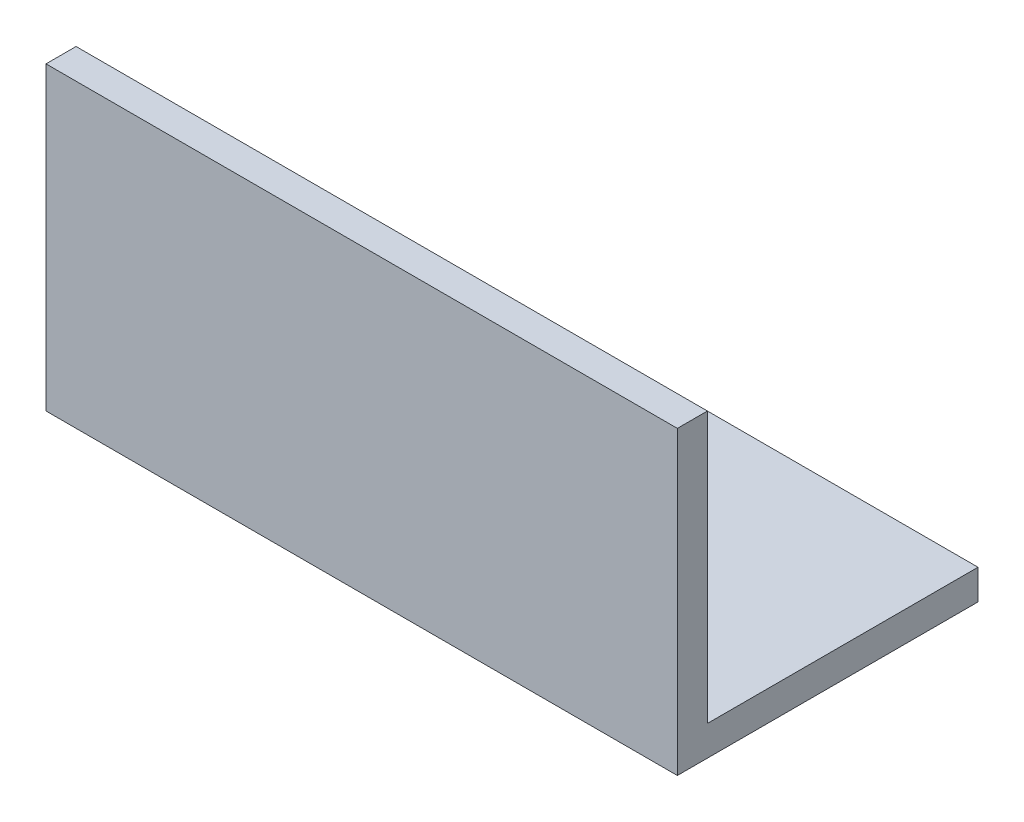
ISO-10303-21;
HEADER;
FILE_DESCRIPTION(('STEP AP214'),'2;1');
FILE_NAME('part.step','',(''),(''),'','','');
FILE_SCHEMA(('AUTOMOTIVE_DESIGN { 1 0 10303 214 1 1 1 1 }'));
ENDSEC;
DATA;
#1=APPLICATION_CONTEXT('core data for automotive mechanical design processes');
#2=APPLICATION_PROTOCOL_DEFINITION('international standard','automotive_design',2000,#1);
#3=PRODUCT_CONTEXT('',#1,'mechanical');
#4=PRODUCT('Part','Part','',(#3));
#5=PRODUCT_RELATED_PRODUCT_CATEGORY('part','',(#4));
#6=PRODUCT_DEFINITION_FORMATION('','',#4);
#7=PRODUCT_DEFINITION_CONTEXT('part definition',#1,'design');
#8=PRODUCT_DEFINITION('design','',#6,#7);
#9=PRODUCT_DEFINITION_SHAPE('','',#8);
#10=(LENGTH_UNIT() NAMED_UNIT(*) SI_UNIT(.MILLI.,.METRE.));
#11=(NAMED_UNIT(*) PLANE_ANGLE_UNIT() SI_UNIT($,.RADIAN.));
#12=(NAMED_UNIT(*) SI_UNIT($,.STERADIAN.) SOLID_ANGLE_UNIT());
#13=UNCERTAINTY_MEASURE_WITH_UNIT(LENGTH_MEASURE(1.E-05),#10,'distance_accuracy_value','');
#14=(GEOMETRIC_REPRESENTATION_CONTEXT(3) GLOBAL_UNCERTAINTY_ASSIGNED_CONTEXT((#13)) GLOBAL_UNIT_ASSIGNED_CONTEXT((#10,
#11,#12)) REPRESENTATION_CONTEXT('',''));
#15=CARTESIAN_POINT('',(0.,0.,0.));
#16=DIRECTION('',(0.,0.,1.));
#17=DIRECTION('',(1.,0.,0.));
#18=AXIS2_PLACEMENT_3D('',#15,#16,#17);
#19=CARTESIAN_POINT('',(-42.,20.,-2.));
#20=DIRECTION('',(0.,1.,0.));
#21=DIRECTION('',(0.,0.,1.));
#22=AXIS2_PLACEMENT_3D('',#19,#20,#21);
#23=PLANE('',#22);
#24=DIRECTION('',(0.,0.,1.));
#25=VECTOR('',#24,1.);
#26=CARTESIAN_POINT('',(0.,20.,-2.));
#27=LINE('',#26,#25);
#28=CARTESIAN_POINT('',(0.,20.,-2.));
#29=VERTEX_POINT('',#28);
#30=CARTESIAN_POINT('',(0.,20.,0.));
#31=VERTEX_POINT('',#30);
#32=EDGE_CURVE('E124',#29,#31,#27,.T.);
#33=ORIENTED_EDGE('',*,*,#32,.F.);
#34=DIRECTION('',(1.,0.,0.));
#35=VECTOR('',#34,1.);
#36=CARTESIAN_POINT('',(-42.,20.,-2.));
#37=LINE('',#36,#35);
#38=CARTESIAN_POINT('',(-42.,20.,-2.));
#39=VERTEX_POINT('',#38);
#40=EDGE_CURVE('E11',#39,#29,#37,.T.);
#41=ORIENTED_EDGE('',*,*,#40,.F.);
#42=DIRECTION('',(0.,0.,1.));
#43=VECTOR('',#42,1.);
#44=CARTESIAN_POINT('',(-42.,20.,-2.));
#45=LINE('',#44,#43);
#46=CARTESIAN_POINT('',(-42.,20.,0.));
#47=VERTEX_POINT('',#46);
#48=EDGE_CURVE('E138',#39,#47,#45,.T.);
#49=ORIENTED_EDGE('',*,*,#48,.T.);
#50=DIRECTION('',(1.,0.,0.));
#51=VECTOR('',#50,1.);
#52=CARTESIAN_POINT('',(-42.,20.,0.));
#53=LINE('',#52,#51);
#54=EDGE_CURVE('E42',#47,#31,#53,.T.);
#55=ORIENTED_EDGE('',*,*,#54,.T.);
#56=EDGE_LOOP('',(#33,#41,#49,#55));
#57=FACE_BOUND('',#56,.T.);
#58=ADVANCED_FACE('F39',(#57),#23,.T.);
#59=CARTESIAN_POINT('',(-42.,2.,-2.));
#60=DIRECTION('',(0.,0.,-1.));
#61=DIRECTION('',(0.,1.,0.));
#62=AXIS2_PLACEMENT_3D('',#59,#60,#61);
#63=PLANE('',#62);
#64=DIRECTION('',(0.,1.,0.));
#65=VECTOR('',#64,1.);
#66=CARTESIAN_POINT('',(0.,2.,-2.));
#67=LINE('',#66,#65);
#68=CARTESIAN_POINT('',(0.,2.,-2.));
#69=VERTEX_POINT('',#68);
#70=EDGE_CURVE('E136',#69,#29,#67,.T.);
#71=ORIENTED_EDGE('',*,*,#70,.F.);
#72=DIRECTION('',(1.,0.,0.));
#73=VECTOR('',#72,1.);
#74=CARTESIAN_POINT('',(-42.,2.,-2.));
#75=LINE('',#74,#73);
#76=CARTESIAN_POINT('',(-42.,2.,-2.));
#77=VERTEX_POINT('',#76);
#78=EDGE_CURVE('E48',#77,#69,#75,.T.);
#79=ORIENTED_EDGE('',*,*,#78,.F.);
#80=DIRECTION('',(0.,1.,0.));
#81=VECTOR('',#80,1.);
#82=CARTESIAN_POINT('',(-42.,2.,-2.));
#83=LINE('',#82,#81);
#84=EDGE_CURVE('E114',#77,#39,#83,.T.);
#85=ORIENTED_EDGE('',*,*,#84,.T.);
#86=ORIENTED_EDGE('',*,*,#40,.T.);
#87=EDGE_LOOP('',(#71,#79,#85,#86));
#88=FACE_BOUND('',#87,.T.);
#89=ADVANCED_FACE('F146',(#88),#63,.T.);
#90=CARTESIAN_POINT('',(-42.,2.,-20.));
#91=DIRECTION('',(0.,1.,0.));
#92=DIRECTION('',(0.,0.,1.));
#93=AXIS2_PLACEMENT_3D('',#90,#91,#92);
#94=PLANE('',#93);
#95=DIRECTION('',(0.,0.,1.));
#96=VECTOR('',#95,1.);
#97=CARTESIAN_POINT('',(0.,2.,-20.));
#98=LINE('',#97,#96);
#99=CARTESIAN_POINT('',(0.,2.,-20.));
#100=VERTEX_POINT('',#99);
#101=EDGE_CURVE('E101',#100,#69,#98,.T.);
#102=ORIENTED_EDGE('',*,*,#101,.F.);
#103=DIRECTION('',(1.,0.,0.));
#104=VECTOR('',#103,1.);
#105=CARTESIAN_POINT('',(-42.,2.,-20.));
#106=LINE('',#105,#104);
#107=CARTESIAN_POINT('',(-42.,2.,-20.));
#108=VERTEX_POINT('',#107);
#109=EDGE_CURVE('E96',#108,#100,#106,.T.);
#110=ORIENTED_EDGE('',*,*,#109,.F.);
#111=DIRECTION('',(0.,0.,1.));
#112=VECTOR('',#111,1.);
#113=CARTESIAN_POINT('',(-42.,2.,-20.));
#114=LINE('',#113,#112);
#115=EDGE_CURVE('E99',#108,#77,#114,.T.);
#116=ORIENTED_EDGE('',*,*,#115,.T.);
#117=ORIENTED_EDGE('',*,*,#78,.T.);
#118=EDGE_LOOP('',(#102,#110,#116,#117));
#119=FACE_BOUND('',#118,.T.);
#120=ADVANCED_FACE('F98',(#119),#94,.T.);
#121=CARTESIAN_POINT('',(-42.,0.,-20.));
#122=DIRECTION('',(0.,0.,-1.));
#123=DIRECTION('',(-1.,0.,0.));
#124=AXIS2_PLACEMENT_3D('',#121,#122,#123);
#125=PLANE('',#124);
#126=DIRECTION('',(0.,1.,0.));
#127=VECTOR('',#126,1.);
#128=CARTESIAN_POINT('',(0.,0.,-20.));
#129=LINE('',#128,#127);
#130=CARTESIAN_POINT('',(0.,0.,-20.));
#131=VERTEX_POINT('',#130);
#132=EDGE_CURVE('E133',#131,#100,#129,.T.);
#133=ORIENTED_EDGE('',*,*,#132,.F.);
#134=DIRECTION('',(1.,0.,0.));
#135=VECTOR('',#134,1.);
#136=CARTESIAN_POINT('',(-42.,0.,-20.));
#137=LINE('',#136,#135);
#138=CARTESIAN_POINT('',(-42.,0.,-20.));
#139=VERTEX_POINT('',#138);
#140=EDGE_CURVE('E106',#139,#131,#137,.T.);
#141=ORIENTED_EDGE('',*,*,#140,.F.);
#142=DIRECTION('',(0.,1.,0.));
#143=VECTOR('',#142,1.);
#144=CARTESIAN_POINT('',(-42.,0.,-20.));
#145=LINE('',#144,#143);
#146=EDGE_CURVE('E112',#139,#108,#145,.T.);
#147=ORIENTED_EDGE('',*,*,#146,.T.);
#148=ORIENTED_EDGE('',*,*,#109,.T.);
#149=EDGE_LOOP('',(#133,#141,#147,#148));
#150=FACE_BOUND('',#149,.T.);
#151=ADVANCED_FACE('F116',(#150),#125,.T.);
#152=CARTESIAN_POINT('',(-42.,0.,0.));
#153=DIRECTION('',(0.,-1.,0.));
#154=DIRECTION('',(0.,0.,-1.));
#155=AXIS2_PLACEMENT_3D('',#152,#153,#154);
#156=PLANE('',#155);
#157=DIRECTION('',(0.,0.,-1.));
#158=VECTOR('',#157,1.);
#159=CARTESIAN_POINT('',(0.,0.,0.));
#160=LINE('',#159,#158);
#161=CARTESIAN_POINT('',(0.,0.,0.));
#162=VERTEX_POINT('',#161);
#163=EDGE_CURVE('E130',#162,#131,#160,.T.);
#164=ORIENTED_EDGE('',*,*,#163,.F.);
#165=DIRECTION('',(1.,0.,0.));
#166=VECTOR('',#165,1.);
#167=CARTESIAN_POINT('',(-42.,0.,0.));
#168=LINE('',#167,#166);
#169=CARTESIAN_POINT('',(-42.,0.,0.));
#170=VERTEX_POINT('',#169);
#171=EDGE_CURVE('E141',#170,#162,#168,.T.);
#172=ORIENTED_EDGE('',*,*,#171,.F.);
#173=DIRECTION('',(0.,0.,-1.));
#174=VECTOR('',#173,1.);
#175=CARTESIAN_POINT('',(-42.,0.,0.));
#176=LINE('',#175,#174);
#177=EDGE_CURVE('E117',#170,#139,#176,.T.);
#178=ORIENTED_EDGE('',*,*,#177,.T.);
#179=ORIENTED_EDGE('',*,*,#140,.T.);
#180=EDGE_LOOP('',(#164,#172,#178,#179));
#181=FACE_BOUND('',#180,.T.);
#182=ADVANCED_FACE('F159',(#181),#156,.T.);
#183=CARTESIAN_POINT('',(-42.,20.,0.));
#184=DIRECTION('',(0.,0.,1.));
#185=DIRECTION('',(1.,0.,0.));
#186=AXIS2_PLACEMENT_3D('',#183,#184,#185);
#187=PLANE('',#186);
#188=DIRECTION('',(0.,-1.,0.));
#189=VECTOR('',#188,1.);
#190=CARTESIAN_POINT('',(0.,20.,0.));
#191=LINE('',#190,#189);
#192=EDGE_CURVE('E127',#31,#162,#191,.T.);
#193=ORIENTED_EDGE('',*,*,#192,.F.);
#194=ORIENTED_EDGE('',*,*,#54,.F.);
#195=DIRECTION('',(0.,-1.,0.));
#196=VECTOR('',#195,1.);
#197=CARTESIAN_POINT('',(-42.,20.,0.));
#198=LINE('',#197,#196);
#199=EDGE_CURVE('E119',#47,#170,#198,.T.);
#200=ORIENTED_EDGE('',*,*,#199,.T.);
#201=ORIENTED_EDGE('',*,*,#171,.T.);
#202=EDGE_LOOP('',(#193,#194,#200,#201));
#203=FACE_BOUND('',#202,.T.);
#204=ADVANCED_FACE('F143',(#203),#187,.T.);
#205=CARTESIAN_POINT('',(-42.,0.,0.));
#206=DIRECTION('',(1.,0.,0.));
#207=DIRECTION('',(0.,0.,-1.));
#208=AXIS2_PLACEMENT_3D('',#205,#206,#207);
#209=PLANE('',#208);
#210=ORIENTED_EDGE('',*,*,#48,.F.);
#211=ORIENTED_EDGE('',*,*,#84,.F.);
#212=ORIENTED_EDGE('',*,*,#115,.F.);
#213=ORIENTED_EDGE('',*,*,#146,.F.);
#214=ORIENTED_EDGE('',*,*,#177,.F.);
#215=ORIENTED_EDGE('',*,*,#199,.F.);
#216=EDGE_LOOP('',(#210,#211,#212,#213,#214,#215));
#217=FACE_BOUND('',#216,.T.);
#218=ADVANCED_FACE('F110',(#217),#209,.F.);
#219=CARTESIAN_POINT('',(0.,0.,0.));
#220=DIRECTION('',(1.,0.,0.));
#221=DIRECTION('',(0.,0.,-1.));
#222=AXIS2_PLACEMENT_3D('',#219,#220,#221);
#223=PLANE('',#222);
#224=ORIENTED_EDGE('',*,*,#32,.T.);
#225=ORIENTED_EDGE('',*,*,#192,.T.);
#226=ORIENTED_EDGE('',*,*,#163,.T.);
#227=ORIENTED_EDGE('',*,*,#132,.T.);
#228=ORIENTED_EDGE('',*,*,#101,.T.);
#229=ORIENTED_EDGE('',*,*,#70,.T.);
#230=EDGE_LOOP('',(#224,#225,#226,#227,#228,#229));
#231=FACE_BOUND('',#230,.T.);
#232=ADVANCED_FACE('F145',(#231),#223,.T.);
#233=CLOSED_SHELL('',(#58,#89,#120,#151,#182,#204,#218,#232));
#234=MANIFOLD_SOLID_BREP('B2',#233);
#235=ADVANCED_BREP_SHAPE_REPRESENTATION('',(#18,#234),#14);
#236=SHAPE_DEFINITION_REPRESENTATION(#9,#235);
ENDSEC;
END-ISO-10303-21;
